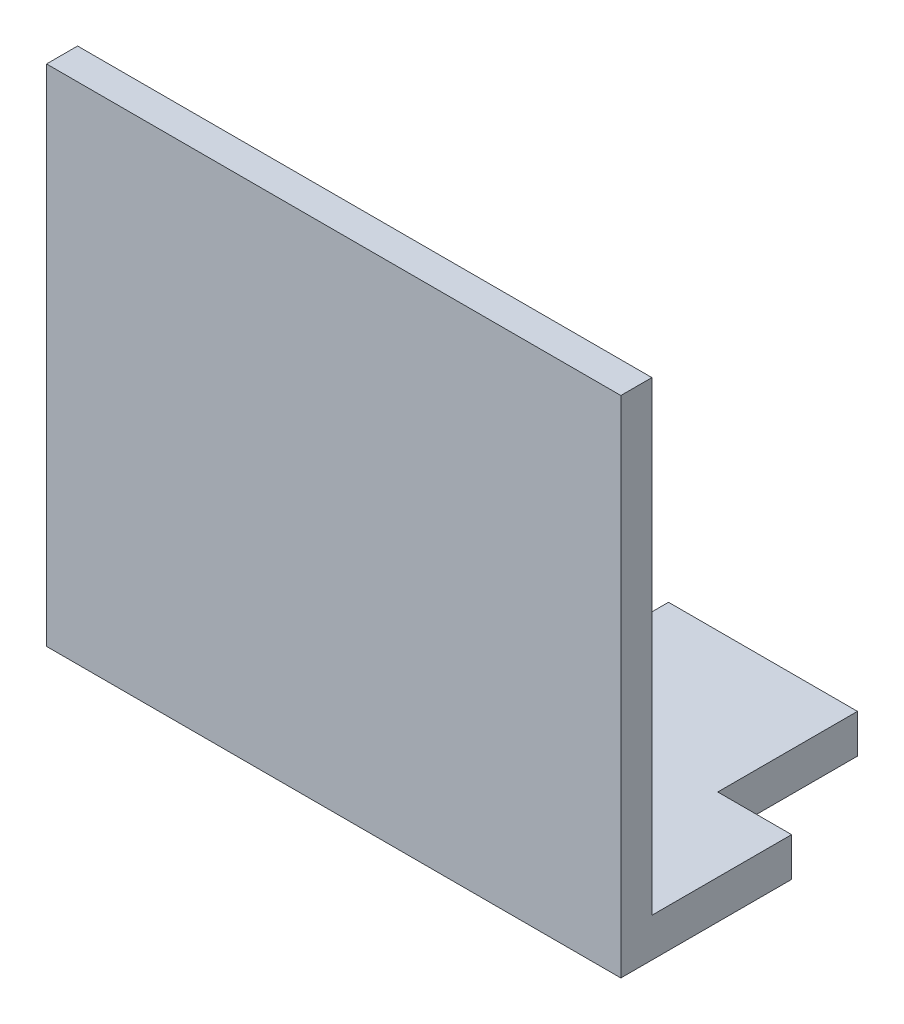
ISO-10303-21;
HEADER;
FILE_DESCRIPTION(('STEP AP214'),'2;1');
FILE_NAME('part.step','',(''),(''),'','','');
FILE_SCHEMA(('AUTOMOTIVE_DESIGN { 1 0 10303 214 1 1 1 1 }'));
ENDSEC;
DATA;
#1=APPLICATION_CONTEXT('core data for automotive mechanical design processes');
#2=APPLICATION_PROTOCOL_DEFINITION('international standard','automotive_design',2000,#1);
#3=PRODUCT_CONTEXT('',#1,'mechanical');
#4=PRODUCT('Part','Part','',(#3));
#5=PRODUCT_RELATED_PRODUCT_CATEGORY('part','',(#4));
#6=PRODUCT_DEFINITION_FORMATION('','',#4);
#7=PRODUCT_DEFINITION_CONTEXT('part definition',#1,'design');
#8=PRODUCT_DEFINITION('design','',#6,#7);
#9=PRODUCT_DEFINITION_SHAPE('','',#8);
#10=(LENGTH_UNIT() NAMED_UNIT(*) SI_UNIT(.MILLI.,.METRE.));
#11=(NAMED_UNIT(*) PLANE_ANGLE_UNIT() SI_UNIT($,.RADIAN.));
#12=(NAMED_UNIT(*) SI_UNIT($,.STERADIAN.) SOLID_ANGLE_UNIT());
#13=UNCERTAINTY_MEASURE_WITH_UNIT(LENGTH_MEASURE(1.E-05),#10,'distance_accuracy_value','');
#14=(GEOMETRIC_REPRESENTATION_CONTEXT(3) GLOBAL_UNCERTAINTY_ASSIGNED_CONTEXT((#13)) GLOBAL_UNIT_ASSIGNED_CONTEXT((#10,
#11,#12)) REPRESENTATION_CONTEXT('',''));
#15=CARTESIAN_POINT('',(0.,0.,0.));
#16=DIRECTION('',(0.,0.,1.));
#17=DIRECTION('',(1.,0.,0.));
#18=AXIS2_PLACEMENT_3D('',#15,#16,#17);
#19=CARTESIAN_POINT('',(0.,0.,-36.));
#20=DIRECTION('',(-1.,0.,0.));
#21=DIRECTION('',(0.,0.,1.));
#22=AXIS2_PLACEMENT_3D('',#19,#20,#21);
#23=PLANE('',#22);
#24=DIRECTION('',(0.,0.,-1.));
#25=VECTOR('',#24,1.);
#26=CARTESIAN_POINT('',(0.,-5.,-36.));
#27=LINE('',#26,#25);
#28=CARTESIAN_POINT('',(0.,-5.,4.));
#29=VERTEX_POINT('',#28);
#30=CARTESIAN_POINT('',(0.,-5.,-18.));
#31=VERTEX_POINT('',#30);
#32=EDGE_CURVE('E131',#29,#31,#27,.T.);
#33=ORIENTED_EDGE('',*,*,#32,.T.);
#34=DIRECTION('',(0.,1.,0.));
#35=VECTOR('',#34,1.);
#36=CARTESIAN_POINT('',(0.,-5.,-18.));
#37=LINE('',#36,#35);
#38=CARTESIAN_POINT('',(0.,0.,-18.));
#39=VERTEX_POINT('',#38);
#40=EDGE_CURVE('E115',#31,#39,#37,.T.);
#41=ORIENTED_EDGE('',*,*,#40,.T.);
#42=DIRECTION('',(0.,0.,1.));
#43=VECTOR('',#42,1.);
#44=CARTESIAN_POINT('',(0.,0.,0.));
#45=LINE('',#44,#43);
#46=CARTESIAN_POINT('',(0.,0.,0.));
#47=VERTEX_POINT('',#46);
#48=EDGE_CURVE('E169',#39,#47,#45,.T.);
#49=ORIENTED_EDGE('',*,*,#48,.T.);
#50=DIRECTION('',(0.,1.,0.));
#51=VECTOR('',#50,1.);
#52=CARTESIAN_POINT('',(0.,0.,0.));
#53=LINE('',#52,#51);
#54=CARTESIAN_POINT('',(0.,60.,0.));
#55=VERTEX_POINT('',#54);
#56=EDGE_CURVE('E171',#47,#55,#53,.T.);
#57=ORIENTED_EDGE('',*,*,#56,.T.);
#58=DIRECTION('',(0.,0.,1.));
#59=VECTOR('',#58,1.);
#60=CARTESIAN_POINT('',(0.,60.,4.));
#61=LINE('',#60,#59);
#62=CARTESIAN_POINT('',(0.,60.,4.));
#63=VERTEX_POINT('',#62);
#64=EDGE_CURVE('E144',#55,#63,#61,.T.);
#65=ORIENTED_EDGE('',*,*,#64,.T.);
#66=DIRECTION('',(0.,-1.,0.));
#67=VECTOR('',#66,1.);
#68=CARTESIAN_POINT('',(0.,-5.,4.));
#69=LINE('',#68,#67);
#70=EDGE_CURVE('E138',#63,#29,#69,.T.);
#71=ORIENTED_EDGE('',*,*,#70,.T.);
#72=EDGE_LOOP('',(#33,#41,#49,#57,#65,#71));
#73=FACE_BOUND('',#72,.T.);
#74=ADVANCED_FACE('F31',(#73),#23,.F.);
#75=CARTESIAN_POINT('',(-150.321687612369,0.,0.));
#76=DIRECTION('',(0.,0.,-1.));
#77=DIRECTION('',(-1.,0.,0.));
#78=AXIS2_PLACEMENT_3D('',#75,#76,#77);
#79=PLANE('',#78);
#80=DIRECTION('',(1.,0.,0.));
#81=VECTOR('',#80,1.);
#82=CARTESIAN_POINT('',(-150.321687612369,0.,0.));
#83=LINE('',#82,#81);
#84=CARTESIAN_POINT('',(-69.8553874895978,0.,0.));
#85=VERTEX_POINT('',#84);
#86=EDGE_CURVE('E139',#85,#47,#83,.T.);
#87=ORIENTED_EDGE('',*,*,#86,.F.);
#88=DIRECTION('',(0.,1.,0.));
#89=VECTOR('',#88,1.);
#90=CARTESIAN_POINT('',(-69.8553874895978,-5.,0.));
#91=LINE('',#90,#89);
#92=CARTESIAN_POINT('',(-69.8553874895978,-5.,0.));
#93=VERTEX_POINT('',#92);
#94=EDGE_CURVE('E318',#93,#85,#91,.T.);
#95=ORIENTED_EDGE('',*,*,#94,.F.);
#96=DIRECTION('',(1.,0.,0.));
#97=VECTOR('',#96,1.);
#98=CARTESIAN_POINT('',(-69.8553874895978,-5.,0.));
#99=LINE('',#98,#97);
#100=CARTESIAN_POINT('',(-74.,-5.,0.));
#101=VERTEX_POINT('',#100);
#102=EDGE_CURVE('E181',#101,#93,#99,.T.);
#103=ORIENTED_EDGE('',*,*,#102,.F.);
#104=DIRECTION('',(0.,1.,0.));
#105=VECTOR('',#104,1.);
#106=CARTESIAN_POINT('',(-74.,0.,0.));
#107=LINE('',#106,#105);
#108=CARTESIAN_POINT('',(-74.,60.,0.));
#109=VERTEX_POINT('',#108);
#110=EDGE_CURVE('E54',#101,#109,#107,.T.);
#111=ORIENTED_EDGE('',*,*,#110,.T.);
#112=DIRECTION('',(1.,0.,0.));
#113=VECTOR('',#112,1.);
#114=CARTESIAN_POINT('',(-150.321687612369,60.,0.));
#115=LINE('',#114,#113);
#116=EDGE_CURVE('E142',#109,#55,#115,.T.);
#117=ORIENTED_EDGE('',*,*,#116,.T.);
#118=ORIENTED_EDGE('',*,*,#56,.F.);
#119=EDGE_LOOP('',(#87,#95,#103,#111,#117,#118));
#120=FACE_BOUND('',#119,.T.);
#121=ADVANCED_FACE('F198',(#120),#79,.T.);
#122=CARTESIAN_POINT('',(-150.321687612369,60.,4.));
#123=DIRECTION('',(0.,1.,0.));
#124=DIRECTION('',(0.,0.,1.));
#125=AXIS2_PLACEMENT_3D('',#122,#123,#124);
#126=PLANE('',#125);
#127=ORIENTED_EDGE('',*,*,#116,.F.);
#128=DIRECTION('',(0.,0.,1.));
#129=VECTOR('',#128,1.);
#130=CARTESIAN_POINT('',(-74.,60.,3.99999999999999));
#131=LINE('',#130,#129);
#132=CARTESIAN_POINT('',(-74.,60.,4.));
#133=VERTEX_POINT('',#132);
#134=EDGE_CURVE('E157',#109,#133,#131,.T.);
#135=ORIENTED_EDGE('',*,*,#134,.T.);
#136=DIRECTION('',(1.,0.,0.));
#137=VECTOR('',#136,1.);
#138=CARTESIAN_POINT('',(-150.321687612369,60.,4.));
#139=LINE('',#138,#137);
#140=EDGE_CURVE('E155',#133,#63,#139,.T.);
#141=ORIENTED_EDGE('',*,*,#140,.T.);
#142=ORIENTED_EDGE('',*,*,#64,.F.);
#143=EDGE_LOOP('',(#127,#135,#141,#142));
#144=FACE_BOUND('',#143,.T.);
#145=ADVANCED_FACE('F175',(#144),#126,.T.);
#146=CARTESIAN_POINT('',(-150.321687612369,-5.,4.));
#147=DIRECTION('',(0.,0.,1.));
#148=DIRECTION('',(0.,-1.,0.));
#149=AXIS2_PLACEMENT_3D('',#146,#147,#148);
#150=PLANE('',#149);
#151=ORIENTED_EDGE('',*,*,#140,.F.);
#152=DIRECTION('',(0.,-1.,0.));
#153=VECTOR('',#152,1.);
#154=CARTESIAN_POINT('',(-74.,-4.99999999999998,4.));
#155=LINE('',#154,#153);
#156=CARTESIAN_POINT('',(-74.,-5.,4.));
#157=VERTEX_POINT('',#156);
#158=EDGE_CURVE('E39',#133,#157,#155,.T.);
#159=ORIENTED_EDGE('',*,*,#158,.T.);
#160=DIRECTION('',(1.,0.,0.));
#161=VECTOR('',#160,1.);
#162=CARTESIAN_POINT('',(-150.321687612369,-5.,4.));
#163=LINE('',#162,#161);
#164=EDGE_CURVE('E153',#157,#29,#163,.T.);
#165=ORIENTED_EDGE('',*,*,#164,.T.);
#166=ORIENTED_EDGE('',*,*,#70,.F.);
#167=EDGE_LOOP('',(#151,#159,#165,#166));
#168=FACE_BOUND('',#167,.T.);
#169=ADVANCED_FACE('F178',(#168),#150,.T.);
#170=CARTESIAN_POINT('',(-150.321687612369,-5.,-36.));
#171=DIRECTION('',(0.,-1.,0.));
#172=DIRECTION('',(0.,0.,-1.));
#173=AXIS2_PLACEMENT_3D('',#170,#171,#172);
#174=PLANE('',#173);
#175=DIRECTION('',(1.,0.,0.));
#176=VECTOR('',#175,1.);
#177=CARTESIAN_POINT('',(-9.51299135537474,-5.,-18.));
#178=LINE('',#177,#176);
#179=CARTESIAN_POINT('',(-9.51299135537474,-5.,-18.));
#180=VERTEX_POINT('',#179);
#181=EDGE_CURVE('E118',#180,#31,#178,.T.);
#182=ORIENTED_EDGE('',*,*,#181,.T.);
#183=ORIENTED_EDGE('',*,*,#32,.F.);
#184=ORIENTED_EDGE('',*,*,#164,.F.);
#185=DIRECTION('',(0.,0.,-1.));
#186=VECTOR('',#185,1.);
#187=CARTESIAN_POINT('',(-74.,-5.,-36.));
#188=LINE('',#187,#186);
#189=EDGE_CURVE('E11',#157,#101,#188,.T.);
#190=ORIENTED_EDGE('',*,*,#189,.T.);
#191=ORIENTED_EDGE('',*,*,#102,.T.);
#192=DIRECTION('',(0.,0.,-1.));
#193=VECTOR('',#192,1.);
#194=CARTESIAN_POINT('',(-69.8553874895978,-5.,-16.));
#195=LINE('',#194,#193);
#196=CARTESIAN_POINT('',(-69.8553874895978,-5.,-16.));
#197=VERTEX_POINT('',#196);
#198=EDGE_CURVE('E313',#93,#197,#195,.T.);
#199=ORIENTED_EDGE('',*,*,#198,.T.);
#200=DIRECTION('',(1.,0.,0.));
#201=VECTOR('',#200,1.);
#202=CARTESIAN_POINT('',(-33.8573819937447,-5.,-16.));
#203=LINE('',#202,#201);
#204=CARTESIAN_POINT('',(-33.8573819937447,-5.,-16.));
#205=VERTEX_POINT('',#204);
#206=EDGE_CURVE('E315',#197,#205,#203,.T.);
#207=ORIENTED_EDGE('',*,*,#206,.T.);
#208=DIRECTION('',(0.,0.,-1.));
#209=VECTOR('',#208,1.);
#210=CARTESIAN_POINT('',(-33.8573819937447,-5.,-39.5929225381759));
#211=LINE('',#210,#209);
#212=CARTESIAN_POINT('',(-33.8573819937447,-5.,-36.));
#213=VERTEX_POINT('',#212);
#214=EDGE_CURVE('E308',#205,#213,#211,.T.);
#215=ORIENTED_EDGE('',*,*,#214,.T.);
#216=DIRECTION('',(1.,0.,0.));
#217=VECTOR('',#216,1.);
#218=CARTESIAN_POINT('',(-150.321687612369,-5.,-36.));
#219=LINE('',#218,#217);
#220=CARTESIAN_POINT('',(-9.51299135537474,-5.,-36.));
#221=VERTEX_POINT('',#220);
#222=EDGE_CURVE('E151',#213,#221,#219,.T.);
#223=ORIENTED_EDGE('',*,*,#222,.T.);
#224=DIRECTION('',(0.,0.,1.));
#225=VECTOR('',#224,1.);
#226=CARTESIAN_POINT('',(-9.51299135537474,-5.,-36.));
#227=LINE('',#226,#225);
#228=EDGE_CURVE('E125',#221,#180,#227,.T.);
#229=ORIENTED_EDGE('',*,*,#228,.T.);
#230=EDGE_LOOP('',(#182,#183,#184,#190,#191,#199,#207,#215,#223,#229));
#231=FACE_BOUND('',#230,.T.);
#232=ADVANCED_FACE('F129',(#231),#174,.T.);
#233=CARTESIAN_POINT('',(-150.321687612369,0.,-36.));
#234=DIRECTION('',(0.,0.,-1.));
#235=DIRECTION('',(-1.,0.,0.));
#236=AXIS2_PLACEMENT_3D('',#233,#234,#235);
#237=PLANE('',#236);
#238=DIRECTION('',(0.,1.,0.));
#239=VECTOR('',#238,1.);
#240=CARTESIAN_POINT('',(-9.51299135537474,-5.,-36.));
#241=LINE('',#240,#239);
#242=CARTESIAN_POINT('',(-9.51299135537473,0.,-36.));
#243=VERTEX_POINT('',#242);
#244=EDGE_CURVE('E46',#221,#243,#241,.T.);
#245=ORIENTED_EDGE('',*,*,#244,.F.);
#246=ORIENTED_EDGE('',*,*,#222,.F.);
#247=DIRECTION('',(0.,-1.,0.));
#248=VECTOR('',#247,1.);
#249=CARTESIAN_POINT('',(-33.8573819937447,0.,-36.));
#250=LINE('',#249,#248);
#251=CARTESIAN_POINT('',(-33.8573819937447,0.,-36.));
#252=VERTEX_POINT('',#251);
#253=EDGE_CURVE('E166',#252,#213,#250,.T.);
#254=ORIENTED_EDGE('',*,*,#253,.F.);
#255=DIRECTION('',(1.,0.,0.));
#256=VECTOR('',#255,1.);
#257=CARTESIAN_POINT('',(-150.321687612369,0.,-36.));
#258=LINE('',#257,#256);
#259=EDGE_CURVE('E148',#252,#243,#258,.T.);
#260=ORIENTED_EDGE('',*,*,#259,.T.);
#261=EDGE_LOOP('',(#245,#246,#254,#260));
#262=FACE_BOUND('',#261,.T.);
#263=ADVANCED_FACE('F194',(#262),#237,.T.);
#264=CARTESIAN_POINT('',(-150.321687612369,0.,0.));
#265=DIRECTION('',(0.,1.,0.));
#266=DIRECTION('',(0.,0.,1.));
#267=AXIS2_PLACEMENT_3D('',#264,#265,#266);
#268=PLANE('',#267);
#269=DIRECTION('',(1.,0.,0.));
#270=VECTOR('',#269,1.);
#271=CARTESIAN_POINT('',(-9.51299135537474,0.,-18.));
#272=LINE('',#271,#270);
#273=CARTESIAN_POINT('',(-9.51299135537474,0.,-18.));
#274=VERTEX_POINT('',#273);
#275=EDGE_CURVE('E121',#274,#39,#272,.T.);
#276=ORIENTED_EDGE('',*,*,#275,.F.);
#277=DIRECTION('',(0.,0.,1.));
#278=VECTOR('',#277,1.);
#279=CARTESIAN_POINT('',(-9.51299135537474,0.,-36.));
#280=LINE('',#279,#278);
#281=EDGE_CURVE('E134',#243,#274,#280,.T.);
#282=ORIENTED_EDGE('',*,*,#281,.F.);
#283=ORIENTED_EDGE('',*,*,#259,.F.);
#284=DIRECTION('',(0.,0.,-1.));
#285=VECTOR('',#284,1.);
#286=CARTESIAN_POINT('',(-33.8573819937447,0.,-39.5929225381759));
#287=LINE('',#286,#285);
#288=CARTESIAN_POINT('',(-33.8573819937447,0.,-16.));
#289=VERTEX_POINT('',#288);
#290=EDGE_CURVE('E306',#289,#252,#287,.T.);
#291=ORIENTED_EDGE('',*,*,#290,.F.);
#292=DIRECTION('',(1.,0.,0.));
#293=VECTOR('',#292,1.);
#294=CARTESIAN_POINT('',(-33.8573819937447,0.,-16.));
#295=LINE('',#294,#293);
#296=CARTESIAN_POINT('',(-69.8553874895978,0.,-16.));
#297=VERTEX_POINT('',#296);
#298=EDGE_CURVE('E311',#297,#289,#295,.T.);
#299=ORIENTED_EDGE('',*,*,#298,.F.);
#300=DIRECTION('',(0.,0.,-1.));
#301=VECTOR('',#300,1.);
#302=CARTESIAN_POINT('',(-69.8553874895978,0.,-16.));
#303=LINE('',#302,#301);
#304=EDGE_CURVE('E320',#85,#297,#303,.T.);
#305=ORIENTED_EDGE('',*,*,#304,.F.);
#306=ORIENTED_EDGE('',*,*,#86,.T.);
#307=ORIENTED_EDGE('',*,*,#48,.F.);
#308=EDGE_LOOP('',(#276,#282,#283,#291,#299,#305,#306,#307));
#309=FACE_BOUND('',#308,.T.);
#310=ADVANCED_FACE('F33',(#309),#268,.T.);
#311=CARTESIAN_POINT('',(-74.,-57.2562122089221,7.99999999999998));
#312=DIRECTION('',(-1.,0.,0.));
#313=DIRECTION('',(0.,0.,-1.));
#314=AXIS2_PLACEMENT_3D('',#311,#312,#313);
#315=PLANE('',#314);
#316=ORIENTED_EDGE('',*,*,#110,.F.);
#317=ORIENTED_EDGE('',*,*,#189,.F.);
#318=ORIENTED_EDGE('',*,*,#158,.F.);
#319=ORIENTED_EDGE('',*,*,#134,.F.);
#320=EDGE_LOOP('',(#316,#317,#318,#319));
#321=FACE_BOUND('',#320,.T.);
#322=ADVANCED_FACE('F182',(#321),#315,.T.);
#323=CARTESIAN_POINT('',(-33.8573819937447,-5.,-39.5929225381759));
#324=DIRECTION('',(1.,0.,0.));
#325=DIRECTION('',(0.,0.,-1.));
#326=AXIS2_PLACEMENT_3D('',#323,#324,#325);
#327=PLANE('',#326);
#328=ORIENTED_EDGE('',*,*,#253,.T.);
#329=ORIENTED_EDGE('',*,*,#214,.F.);
#330=DIRECTION('',(0.,1.,0.));
#331=VECTOR('',#330,1.);
#332=CARTESIAN_POINT('',(-33.8573819937447,-5.,-16.));
#333=LINE('',#332,#331);
#334=EDGE_CURVE('E325',#205,#289,#333,.T.);
#335=ORIENTED_EDGE('',*,*,#334,.T.);
#336=ORIENTED_EDGE('',*,*,#290,.T.);
#337=EDGE_LOOP('',(#328,#329,#335,#336));
#338=FACE_BOUND('',#337,.T.);
#339=ADVANCED_FACE('F184',(#338),#327,.F.);
#340=CARTESIAN_POINT('',(-33.8573819937447,-5.,-16.));
#341=DIRECTION('',(0.,0.,1.));
#342=DIRECTION('',(1.,0.,0.));
#343=AXIS2_PLACEMENT_3D('',#340,#341,#342);
#344=PLANE('',#343);
#345=ORIENTED_EDGE('',*,*,#298,.T.);
#346=ORIENTED_EDGE('',*,*,#334,.F.);
#347=ORIENTED_EDGE('',*,*,#206,.F.);
#348=DIRECTION('',(0.,1.,0.));
#349=VECTOR('',#348,1.);
#350=CARTESIAN_POINT('',(-69.8553874895978,-5.,-16.));
#351=LINE('',#350,#349);
#352=EDGE_CURVE('E327',#197,#297,#351,.T.);
#353=ORIENTED_EDGE('',*,*,#352,.T.);
#354=EDGE_LOOP('',(#345,#346,#347,#353));
#355=FACE_BOUND('',#354,.T.);
#356=ADVANCED_FACE('F191',(#355),#344,.F.);
#357=CARTESIAN_POINT('',(-69.8553874895978,-5.,-16.));
#358=DIRECTION('',(1.,0.,0.));
#359=DIRECTION('',(0.,0.,-1.));
#360=AXIS2_PLACEMENT_3D('',#357,#358,#359);
#361=PLANE('',#360);
#362=ORIENTED_EDGE('',*,*,#304,.T.);
#363=ORIENTED_EDGE('',*,*,#352,.F.);
#364=ORIENTED_EDGE('',*,*,#198,.F.);
#365=ORIENTED_EDGE('',*,*,#94,.T.);
#366=EDGE_LOOP('',(#362,#363,#364,#365));
#367=FACE_BOUND('',#366,.T.);
#368=ADVANCED_FACE('F254',(#367),#361,.F.);
#369=CARTESIAN_POINT('',(-9.51299135537474,-5.,-18.));
#370=DIRECTION('',(0.,0.,1.));
#371=DIRECTION('',(1.,0.,0.));
#372=AXIS2_PLACEMENT_3D('',#369,#370,#371);
#373=PLANE('',#372);
#374=ORIENTED_EDGE('',*,*,#275,.T.);
#375=ORIENTED_EDGE('',*,*,#40,.F.);
#376=ORIENTED_EDGE('',*,*,#181,.F.);
#377=DIRECTION('',(0.,1.,0.));
#378=VECTOR('',#377,1.);
#379=CARTESIAN_POINT('',(-9.51299135537474,-5.,-18.));
#380=LINE('',#379,#378);
#381=EDGE_CURVE('E299',#180,#274,#380,.T.);
#382=ORIENTED_EDGE('',*,*,#381,.T.);
#383=EDGE_LOOP('',(#374,#375,#376,#382));
#384=FACE_BOUND('',#383,.T.);
#385=ADVANCED_FACE('F117',(#384),#373,.F.);
#386=CARTESIAN_POINT('',(-9.51299135537474,-5.,-36.));
#387=DIRECTION('',(-1.,0.,0.));
#388=DIRECTION('',(0.,0.,1.));
#389=AXIS2_PLACEMENT_3D('',#386,#387,#388);
#390=PLANE('',#389);
#391=ORIENTED_EDGE('',*,*,#281,.T.);
#392=ORIENTED_EDGE('',*,*,#381,.F.);
#393=ORIENTED_EDGE('',*,*,#228,.F.);
#394=ORIENTED_EDGE('',*,*,#244,.T.);
#395=EDGE_LOOP('',(#391,#392,#393,#394));
#396=FACE_BOUND('',#395,.T.);
#397=ADVANCED_FACE('F269',(#396),#390,.F.);
#398=CLOSED_SHELL('',(#74,#121,#145,#169,#232,#263,#310,#322,#339,#356,#368,#385,#397));
#399=MANIFOLD_SOLID_BREP('B2',#398);
#400=ADVANCED_BREP_SHAPE_REPRESENTATION('',(#18,#399),#14);
#401=SHAPE_DEFINITION_REPRESENTATION(#9,#400);
ENDSEC;
END-ISO-10303-21;
